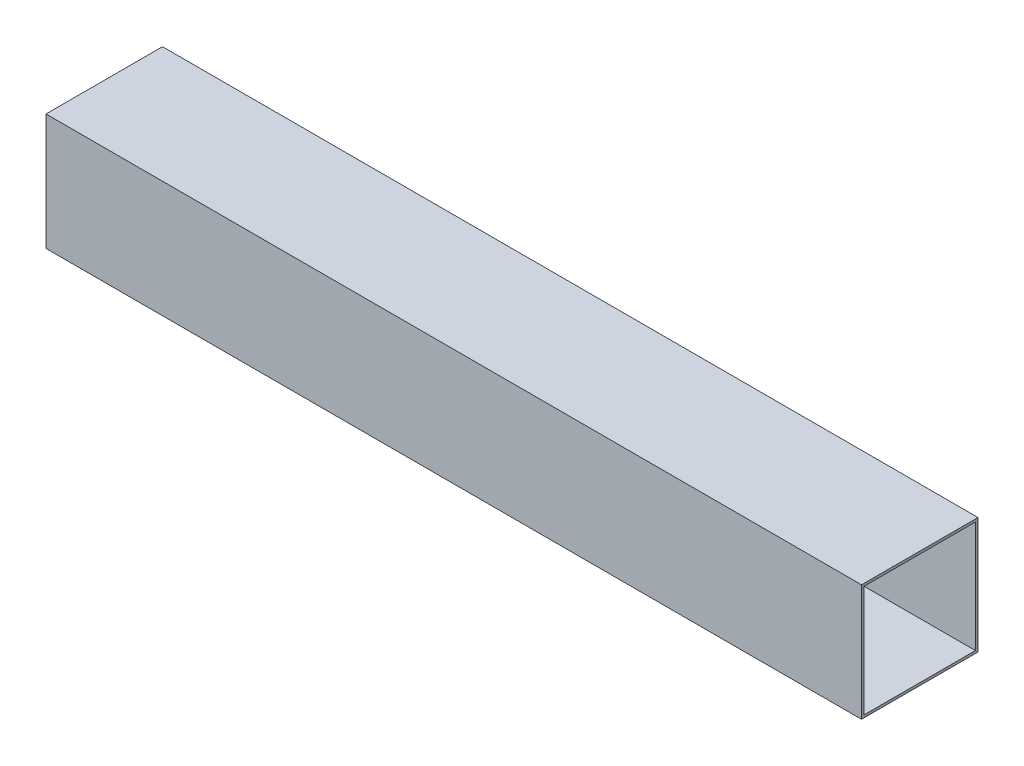
ISO-10303-21;
HEADER;
FILE_DESCRIPTION(('STEP AP214'),'2;1');
FILE_NAME('part.step','',(''),(''),'','','');
FILE_SCHEMA(('AUTOMOTIVE_DESIGN { 1 0 10303 214 1 1 1 1 }'));
ENDSEC;
DATA;
#1=APPLICATION_CONTEXT('core data for automotive mechanical design processes');
#2=APPLICATION_PROTOCOL_DEFINITION('international standard','automotive_design',2000,#1);
#3=PRODUCT_CONTEXT('',#1,'mechanical');
#4=PRODUCT('Part','Part','',(#3));
#5=PRODUCT_RELATED_PRODUCT_CATEGORY('part','',(#4));
#6=PRODUCT_DEFINITION_FORMATION('','',#4);
#7=PRODUCT_DEFINITION_CONTEXT('part definition',#1,'design');
#8=PRODUCT_DEFINITION('design','',#6,#7);
#9=PRODUCT_DEFINITION_SHAPE('','',#8);
#10=(LENGTH_UNIT() NAMED_UNIT(*) SI_UNIT(.MILLI.,.METRE.));
#11=(NAMED_UNIT(*) PLANE_ANGLE_UNIT() SI_UNIT($,.RADIAN.));
#12=(NAMED_UNIT(*) SI_UNIT($,.STERADIAN.) SOLID_ANGLE_UNIT());
#13=UNCERTAINTY_MEASURE_WITH_UNIT(LENGTH_MEASURE(1.E-05),#10,'distance_accuracy_value','');
#14=(GEOMETRIC_REPRESENTATION_CONTEXT(3) GLOBAL_UNCERTAINTY_ASSIGNED_CONTEXT((#13)) GLOBAL_UNIT_ASSIGNED_CONTEXT((#10,
#11,#12)) REPRESENTATION_CONTEXT('',''));
#15=CARTESIAN_POINT('',(0.,0.,0.));
#16=DIRECTION('',(0.,0.,1.));
#17=DIRECTION('',(1.,0.,0.));
#18=AXIS2_PLACEMENT_3D('',#15,#16,#17);
#19=CARTESIAN_POINT('',(177.8,12.7,12.7));
#20=DIRECTION('',(0.,-1.,0.));
#21=DIRECTION('',(0.,0.,-1.));
#22=AXIS2_PLACEMENT_3D('',#19,#20,#21);
#23=PLANE('',#22);
#24=DIRECTION('',(0.,0.,1.));
#25=VECTOR('',#24,1.);
#26=CARTESIAN_POINT('',(0.,12.7,12.7));
#27=LINE('',#26,#25);
#28=CARTESIAN_POINT('',(0.,12.7,-12.7));
#29=VERTEX_POINT('',#28);
#30=CARTESIAN_POINT('',(0.,12.7,12.7));
#31=VERTEX_POINT('',#30);
#32=EDGE_CURVE('E146',#29,#31,#27,.T.);
#33=ORIENTED_EDGE('',*,*,#32,.T.);
#34=DIRECTION('',(-1.,0.,0.));
#35=VECTOR('',#34,1.);
#36=CARTESIAN_POINT('',(177.8,12.7,12.7));
#37=LINE('',#36,#35);
#38=CARTESIAN_POINT('',(177.8,12.7,12.7));
#39=VERTEX_POINT('',#38);
#40=EDGE_CURVE('E11',#39,#31,#37,.T.);
#41=ORIENTED_EDGE('',*,*,#40,.F.);
#42=DIRECTION('',(0.,0.,1.));
#43=VECTOR('',#42,1.);
#44=CARTESIAN_POINT('',(177.8,12.7,12.7));
#45=LINE('',#44,#43);
#46=CARTESIAN_POINT('',(177.8,12.7,-12.7));
#47=VERTEX_POINT('',#46);
#48=EDGE_CURVE('E120',#47,#39,#45,.T.);
#49=ORIENTED_EDGE('',*,*,#48,.F.);
#50=DIRECTION('',(-1.,0.,0.));
#51=VECTOR('',#50,1.);
#52=CARTESIAN_POINT('',(177.8,12.7,-12.7));
#53=LINE('',#52,#51);
#54=EDGE_CURVE('E153',#47,#29,#53,.T.);
#55=ORIENTED_EDGE('',*,*,#54,.T.);
#56=EDGE_LOOP('',(#33,#41,#49,#55));
#57=FACE_BOUND('',#56,.T.);
#58=ADVANCED_FACE('F39',(#57),#23,.F.);
#59=CARTESIAN_POINT('',(177.8,12.7,12.7));
#60=DIRECTION('',(0.,0.,-1.));
#61=DIRECTION('',(-1.,0.,0.));
#62=AXIS2_PLACEMENT_3D('',#59,#60,#61);
#63=PLANE('',#62);
#64=DIRECTION('',(0.,-1.,0.));
#65=VECTOR('',#64,1.);
#66=CARTESIAN_POINT('',(0.,12.7,12.7));
#67=LINE('',#66,#65);
#68=CARTESIAN_POINT('',(0.,-12.7,12.7));
#69=VERTEX_POINT('',#68);
#70=EDGE_CURVE('E125',#31,#69,#67,.T.);
#71=ORIENTED_EDGE('',*,*,#70,.T.);
#72=DIRECTION('',(-1.,0.,0.));
#73=VECTOR('',#72,1.);
#74=CARTESIAN_POINT('',(177.8,-12.7,12.7));
#75=LINE('',#74,#73);
#76=CARTESIAN_POINT('',(177.8,-12.7,12.7));
#77=VERTEX_POINT('',#76);
#78=EDGE_CURVE('E49',#77,#69,#75,.T.);
#79=ORIENTED_EDGE('',*,*,#78,.F.);
#80=DIRECTION('',(0.,-1.,0.));
#81=VECTOR('',#80,1.);
#82=CARTESIAN_POINT('',(177.8,12.7,12.7));
#83=LINE('',#82,#81);
#84=EDGE_CURVE('E114',#39,#77,#83,.T.);
#85=ORIENTED_EDGE('',*,*,#84,.F.);
#86=ORIENTED_EDGE('',*,*,#40,.T.);
#87=EDGE_LOOP('',(#71,#79,#85,#86));
#88=FACE_BOUND('',#87,.T.);
#89=ADVANCED_FACE('F124',(#88),#63,.F.);
#90=CARTESIAN_POINT('',(177.8,-12.7,-12.7));
#91=DIRECTION('',(0.,1.,0.));
#92=DIRECTION('',(0.,0.,1.));
#93=AXIS2_PLACEMENT_3D('',#90,#91,#92);
#94=PLANE('',#93);
#95=DIRECTION('',(0.,0.,-1.));
#96=VECTOR('',#95,1.);
#97=CARTESIAN_POINT('',(0.,-12.7,-12.7));
#98=LINE('',#97,#96);
#99=CARTESIAN_POINT('',(0.,-12.7,-12.7));
#100=VERTEX_POINT('',#99);
#101=EDGE_CURVE('E87',#69,#100,#98,.T.);
#102=ORIENTED_EDGE('',*,*,#101,.T.);
#103=DIRECTION('',(-1.,0.,0.));
#104=VECTOR('',#103,1.);
#105=CARTESIAN_POINT('',(177.8,-12.7,-12.7));
#106=LINE('',#105,#104);
#107=CARTESIAN_POINT('',(177.8,-12.7,-12.7));
#108=VERTEX_POINT('',#107);
#109=EDGE_CURVE('E126',#108,#100,#106,.T.);
#110=ORIENTED_EDGE('',*,*,#109,.F.);
#111=DIRECTION('',(0.,0.,-1.));
#112=VECTOR('',#111,1.);
#113=CARTESIAN_POINT('',(177.8,-12.7,-12.7));
#114=LINE('',#113,#112);
#115=EDGE_CURVE('E118',#77,#108,#114,.T.);
#116=ORIENTED_EDGE('',*,*,#115,.F.);
#117=ORIENTED_EDGE('',*,*,#78,.T.);
#118=EDGE_LOOP('',(#102,#110,#116,#117));
#119=FACE_BOUND('',#118,.T.);
#120=ADVANCED_FACE('F128',(#119),#94,.F.);
#121=CARTESIAN_POINT('',(177.8,12.1412,12.1412));
#122=DIRECTION('',(0.,0.,-1.));
#123=DIRECTION('',(-1.,0.,0.));
#124=AXIS2_PLACEMENT_3D('',#121,#122,#123);
#125=PLANE('',#124);
#126=DIRECTION('',(0.,-1.,0.));
#127=VECTOR('',#126,1.);
#128=CARTESIAN_POINT('',(0.,12.1412,12.1412));
#129=LINE('',#128,#127);
#130=CARTESIAN_POINT('',(0.,12.1412,12.1412));
#131=VERTEX_POINT('',#130);
#132=CARTESIAN_POINT('',(0.,-12.1412,12.1412));
#133=VERTEX_POINT('',#132);
#134=EDGE_CURVE('E134',#131,#133,#129,.T.);
#135=ORIENTED_EDGE('',*,*,#134,.F.);
#136=DIRECTION('',(-1.,0.,0.));
#137=VECTOR('',#136,1.);
#138=CARTESIAN_POINT('',(177.8,12.1412,12.1412));
#139=LINE('',#138,#137);
#140=CARTESIAN_POINT('',(177.8,12.1412,12.1412));
#141=VERTEX_POINT('',#140);
#142=EDGE_CURVE('E43',#141,#131,#139,.T.);
#143=ORIENTED_EDGE('',*,*,#142,.F.);
#144=DIRECTION('',(0.,-1.,0.));
#145=VECTOR('',#144,1.);
#146=CARTESIAN_POINT('',(177.8,12.1412,12.1412));
#147=LINE('',#146,#145);
#148=CARTESIAN_POINT('',(177.8,-12.1412,12.1412));
#149=VERTEX_POINT('',#148);
#150=EDGE_CURVE('E152',#141,#149,#147,.T.);
#151=ORIENTED_EDGE('',*,*,#150,.T.);
#152=DIRECTION('',(-1.,0.,0.));
#153=VECTOR('',#152,1.);
#154=CARTESIAN_POINT('',(177.8,-12.1412,12.1412));
#155=LINE('',#154,#153);
#156=EDGE_CURVE('E130',#149,#133,#155,.T.);
#157=ORIENTED_EDGE('',*,*,#156,.T.);
#158=EDGE_LOOP('',(#135,#143,#151,#157));
#159=FACE_BOUND('',#158,.T.);
#160=ADVANCED_FACE('F41',(#159),#125,.T.);
#161=CARTESIAN_POINT('',(177.8,12.1412,12.1412));
#162=DIRECTION('',(0.,-1.,0.));
#163=DIRECTION('',(0.,0.,-1.));
#164=AXIS2_PLACEMENT_3D('',#161,#162,#163);
#165=PLANE('',#164);
#166=DIRECTION('',(0.,0.,1.));
#167=VECTOR('',#166,1.);
#168=CARTESIAN_POINT('',(0.,12.1412,12.1412));
#169=LINE('',#168,#167);
#170=CARTESIAN_POINT('',(0.,12.1412,-12.1412));
#171=VERTEX_POINT('',#170);
#172=EDGE_CURVE('E137',#171,#131,#169,.T.);
#173=ORIENTED_EDGE('',*,*,#172,.F.);
#174=DIRECTION('',(-1.,0.,0.));
#175=VECTOR('',#174,1.);
#176=CARTESIAN_POINT('',(177.8,12.1412,-12.1412));
#177=LINE('',#176,#175);
#178=CARTESIAN_POINT('',(177.8,12.1412,-12.1412));
#179=VERTEX_POINT('',#178);
#180=EDGE_CURVE('E158',#179,#171,#177,.T.);
#181=ORIENTED_EDGE('',*,*,#180,.F.);
#182=DIRECTION('',(0.,0.,1.));
#183=VECTOR('',#182,1.);
#184=CARTESIAN_POINT('',(177.8,12.1412,12.1412));
#185=LINE('',#184,#183);
#186=EDGE_CURVE('E167',#179,#141,#185,.T.);
#187=ORIENTED_EDGE('',*,*,#186,.T.);
#188=ORIENTED_EDGE('',*,*,#142,.T.);
#189=EDGE_LOOP('',(#173,#181,#187,#188));
#190=FACE_BOUND('',#189,.T.);
#191=ADVANCED_FACE('F165',(#190),#165,.T.);
#192=CARTESIAN_POINT('',(177.8,-12.1412,-12.1412));
#193=DIRECTION('',(0.,0.,1.));
#194=DIRECTION('',(1.,0.,0.));
#195=AXIS2_PLACEMENT_3D('',#192,#193,#194);
#196=PLANE('',#195);
#197=DIRECTION('',(0.,1.,0.));
#198=VECTOR('',#197,1.);
#199=CARTESIAN_POINT('',(0.,-12.1412,-12.1412));
#200=LINE('',#199,#198);
#201=CARTESIAN_POINT('',(0.,-12.1412,-12.1412));
#202=VERTEX_POINT('',#201);
#203=EDGE_CURVE('E140',#202,#171,#200,.T.);
#204=ORIENTED_EDGE('',*,*,#203,.F.);
#205=DIRECTION('',(-1.,0.,0.));
#206=VECTOR('',#205,1.);
#207=CARTESIAN_POINT('',(177.8,-12.1412,-12.1412));
#208=LINE('',#207,#206);
#209=CARTESIAN_POINT('',(177.8,-12.1412,-12.1412));
#210=VERTEX_POINT('',#209);
#211=EDGE_CURVE('E157',#210,#202,#208,.T.);
#212=ORIENTED_EDGE('',*,*,#211,.F.);
#213=DIRECTION('',(0.,1.,0.));
#214=VECTOR('',#213,1.);
#215=CARTESIAN_POINT('',(177.8,-12.1412,-12.1412));
#216=LINE('',#215,#214);
#217=EDGE_CURVE('E174',#210,#179,#216,.T.);
#218=ORIENTED_EDGE('',*,*,#217,.T.);
#219=ORIENTED_EDGE('',*,*,#180,.T.);
#220=EDGE_LOOP('',(#204,#212,#218,#219));
#221=FACE_BOUND('',#220,.T.);
#222=ADVANCED_FACE('F172',(#221),#196,.T.);
#223=CARTESIAN_POINT('',(177.8,-12.1412,-12.1412));
#224=DIRECTION('',(0.,1.,0.));
#225=DIRECTION('',(0.,0.,1.));
#226=AXIS2_PLACEMENT_3D('',#223,#224,#225);
#227=PLANE('',#226);
#228=DIRECTION('',(0.,0.,-1.));
#229=VECTOR('',#228,1.);
#230=CARTESIAN_POINT('',(0.,-12.1412,-12.1412));
#231=LINE('',#230,#229);
#232=EDGE_CURVE('E143',#133,#202,#231,.T.);
#233=ORIENTED_EDGE('',*,*,#232,.F.);
#234=ORIENTED_EDGE('',*,*,#156,.F.);
#235=DIRECTION('',(0.,0.,-1.));
#236=VECTOR('',#235,1.);
#237=CARTESIAN_POINT('',(177.8,-12.1412,-12.1412));
#238=LINE('',#237,#236);
#239=EDGE_CURVE('E179',#149,#210,#238,.T.);
#240=ORIENTED_EDGE('',*,*,#239,.T.);
#241=ORIENTED_EDGE('',*,*,#211,.T.);
#242=EDGE_LOOP('',(#233,#234,#240,#241));
#243=FACE_BOUND('',#242,.T.);
#244=ADVANCED_FACE('F181',(#243),#227,.T.);
#245=CARTESIAN_POINT('',(177.8,-12.7,-12.7));
#246=DIRECTION('',(0.,0.,1.));
#247=DIRECTION('',(0.,-1.,0.));
#248=AXIS2_PLACEMENT_3D('',#245,#246,#247);
#249=PLANE('',#248);
#250=DIRECTION('',(0.,1.,0.));
#251=VECTOR('',#250,1.);
#252=CARTESIAN_POINT('',(0.,-12.7,-12.7));
#253=LINE('',#252,#251);
#254=EDGE_CURVE('E93',#100,#29,#253,.T.);
#255=ORIENTED_EDGE('',*,*,#254,.T.);
#256=ORIENTED_EDGE('',*,*,#54,.F.);
#257=DIRECTION('',(0.,1.,0.));
#258=VECTOR('',#257,1.);
#259=CARTESIAN_POINT('',(177.8,-12.7,-12.7));
#260=LINE('',#259,#258);
#261=EDGE_CURVE('E58',#108,#47,#260,.T.);
#262=ORIENTED_EDGE('',*,*,#261,.F.);
#263=ORIENTED_EDGE('',*,*,#109,.T.);
#264=EDGE_LOOP('',(#255,#256,#262,#263));
#265=FACE_BOUND('',#264,.T.);
#266=ADVANCED_FACE('F186',(#265),#249,.F.);
#267=CARTESIAN_POINT('',(177.8,0.,0.));
#268=DIRECTION('',(1.,0.,0.));
#269=DIRECTION('',(0.,0.,-1.));
#270=AXIS2_PLACEMENT_3D('',#267,#268,#269);
#271=PLANE('',#270);
#272=ORIENTED_EDGE('',*,*,#150,.F.);
#273=ORIENTED_EDGE('',*,*,#186,.F.);
#274=ORIENTED_EDGE('',*,*,#217,.F.);
#275=ORIENTED_EDGE('',*,*,#239,.F.);
#276=EDGE_LOOP('',(#272,#273,#274,#275));
#277=FACE_BOUND('',#276,.T.);
#278=ORIENTED_EDGE('',*,*,#48,.T.);
#279=ORIENTED_EDGE('',*,*,#84,.T.);
#280=ORIENTED_EDGE('',*,*,#115,.T.);
#281=ORIENTED_EDGE('',*,*,#261,.T.);
#282=EDGE_LOOP('',(#278,#279,#280,#281));
#283=FACE_BOUND('',#282,.T.);
#284=ADVANCED_FACE('F116',(#277,#283),#271,.T.);
#285=CARTESIAN_POINT('',(0.,0.,0.));
#286=DIRECTION('',(1.,0.,0.));
#287=DIRECTION('',(0.,0.,-1.));
#288=AXIS2_PLACEMENT_3D('',#285,#286,#287);
#289=PLANE('',#288);
#290=ORIENTED_EDGE('',*,*,#134,.T.);
#291=ORIENTED_EDGE('',*,*,#232,.T.);
#292=ORIENTED_EDGE('',*,*,#203,.T.);
#293=ORIENTED_EDGE('',*,*,#172,.T.);
#294=EDGE_LOOP('',(#290,#291,#292,#293));
#295=FACE_BOUND('',#294,.T.);
#296=ORIENTED_EDGE('',*,*,#32,.F.);
#297=ORIENTED_EDGE('',*,*,#254,.F.);
#298=ORIENTED_EDGE('',*,*,#101,.F.);
#299=ORIENTED_EDGE('',*,*,#70,.F.);
#300=EDGE_LOOP('',(#296,#297,#298,#299));
#301=FACE_BOUND('',#300,.T.);
#302=ADVANCED_FACE('F170',(#295,#301),#289,.F.);
#303=CLOSED_SHELL('',(#58,#89,#120,#160,#191,#222,#244,#266,#284,#302));
#304=MANIFOLD_SOLID_BREP('B2',#303);
#305=ADVANCED_BREP_SHAPE_REPRESENTATION('',(#18,#304),#14);
#306=SHAPE_DEFINITION_REPRESENTATION(#9,#305);
ENDSEC;
END-ISO-10303-21;
